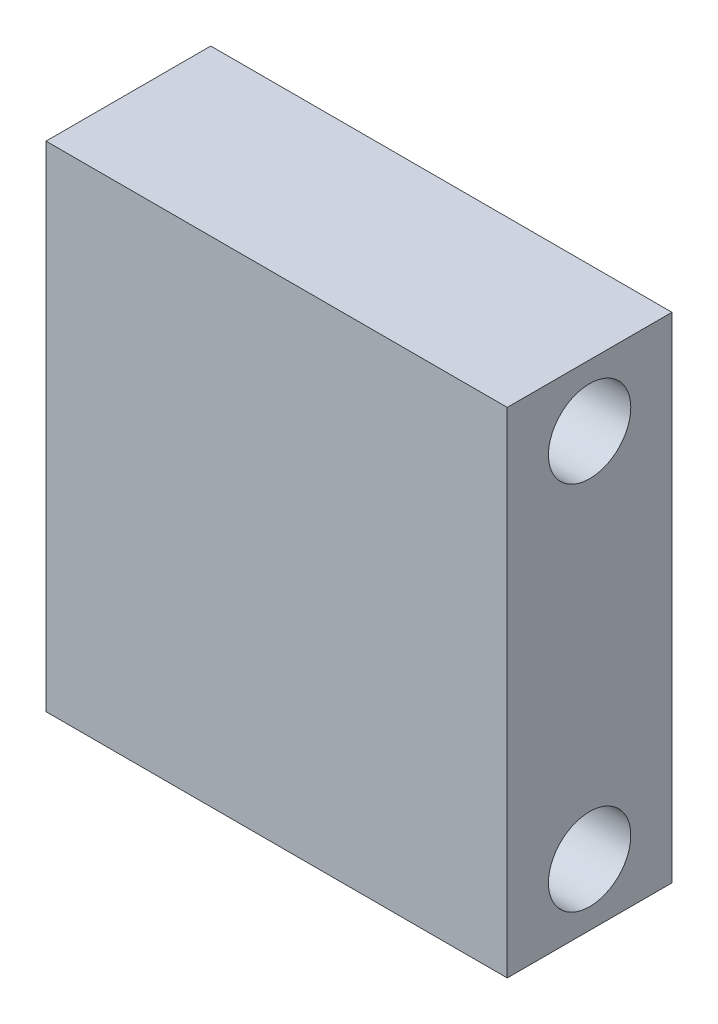
ISO-10303-21;
HEADER;
FILE_DESCRIPTION(('STEP AP214'),'2;1');
FILE_NAME('part.step','',(''),(''),'','','');
FILE_SCHEMA(('AUTOMOTIVE_DESIGN { 1 0 10303 214 1 1 1 1 }'));
ENDSEC;
DATA;
#1=APPLICATION_CONTEXT('core data for automotive mechanical design processes');
#2=APPLICATION_PROTOCOL_DEFINITION('international standard','automotive_design',2000,#1);
#3=PRODUCT_CONTEXT('',#1,'mechanical');
#4=PRODUCT('Part','Part','',(#3));
#5=PRODUCT_RELATED_PRODUCT_CATEGORY('part','',(#4));
#6=PRODUCT_DEFINITION_FORMATION('','',#4);
#7=PRODUCT_DEFINITION_CONTEXT('part definition',#1,'design');
#8=PRODUCT_DEFINITION('design','',#6,#7);
#9=PRODUCT_DEFINITION_SHAPE('','',#8);
#10=(LENGTH_UNIT() NAMED_UNIT(*) SI_UNIT(.MILLI.,.METRE.));
#11=(NAMED_UNIT(*) PLANE_ANGLE_UNIT() SI_UNIT($,.RADIAN.));
#12=(NAMED_UNIT(*) SI_UNIT($,.STERADIAN.) SOLID_ANGLE_UNIT());
#13=UNCERTAINTY_MEASURE_WITH_UNIT(LENGTH_MEASURE(1.E-05),#10,'distance_accuracy_value','');
#14=(GEOMETRIC_REPRESENTATION_CONTEXT(3) GLOBAL_UNCERTAINTY_ASSIGNED_CONTEXT((#13)) GLOBAL_UNIT_ASSIGNED_CONTEXT((#10,
#11,#12)) REPRESENTATION_CONTEXT('',''));
#15=CARTESIAN_POINT('',(0.,0.,0.));
#16=DIRECTION('',(0.,0.,1.));
#17=DIRECTION('',(1.,0.,0.));
#18=AXIS2_PLACEMENT_3D('',#15,#16,#17);
#19=CARTESIAN_POINT('',(56.,0.,0.));
#20=DIRECTION('',(1.,0.,0.));
#21=DIRECTION('',(0.,0.,-1.));
#22=AXIS2_PLACEMENT_3D('',#19,#20,#21);
#23=PLANE('',#22);
#24=CARTESIAN_POINT('',(56.,-22.5,0.));
#25=DIRECTION('',(1.,0.,0.));
#26=DIRECTION('',(0.,0.,1.));
#27=AXIS2_PLACEMENT_3D('',#24,#25,#26);
#28=CIRCLE('',#27,5.);
#29=CARTESIAN_POINT('',(56.,-22.5,5.));
#30=VERTEX_POINT('',#29);
#31=EDGE_CURVE('E100',#30,#30,#28,.T.);
#32=ORIENTED_EDGE('',*,*,#31,.F.);
#33=EDGE_LOOP('',(#32));
#34=FACE_BOUND('',#33,.T.);
#35=DIRECTION('',(0.,1.,0.));
#36=VECTOR('',#35,1.);
#37=CARTESIAN_POINT('',(56.,30.,-9.99999999999999));
#38=LINE('',#37,#36);
#39=CARTESIAN_POINT('',(56.,-30.,-10.));
#40=VERTEX_POINT('',#39);
#41=CARTESIAN_POINT('',(56.,30.,-9.99999999999999));
#42=VERTEX_POINT('',#41);
#43=EDGE_CURVE('E85',#40,#42,#38,.T.);
#44=ORIENTED_EDGE('',*,*,#43,.T.);
#45=DIRECTION('',(0.,0.,1.));
#46=VECTOR('',#45,1.);
#47=CARTESIAN_POINT('',(56.,30.,10.));
#48=LINE('',#47,#46);
#49=CARTESIAN_POINT('',(56.,30.,10.));
#50=VERTEX_POINT('',#49);
#51=EDGE_CURVE('E80',#42,#50,#48,.T.);
#52=ORIENTED_EDGE('',*,*,#51,.T.);
#53=DIRECTION('',(0.,-1.,0.));
#54=VECTOR('',#53,1.);
#55=CARTESIAN_POINT('',(56.,30.,10.));
#56=LINE('',#55,#54);
#57=CARTESIAN_POINT('',(56.,-30.,10.));
#58=VERTEX_POINT('',#57);
#59=EDGE_CURVE('E83',#50,#58,#56,.T.);
#60=ORIENTED_EDGE('',*,*,#59,.T.);
#61=DIRECTION('',(0.,0.,-1.));
#62=VECTOR('',#61,1.);
#63=CARTESIAN_POINT('',(56.,-30.,10.));
#64=LINE('',#63,#62);
#65=EDGE_CURVE('E50',#58,#40,#64,.T.);
#66=ORIENTED_EDGE('',*,*,#65,.T.);
#67=EDGE_LOOP('',(#44,#52,#60,#66));
#68=FACE_BOUND('',#67,.T.);
#69=CARTESIAN_POINT('',(56.,22.5,0.));
#70=DIRECTION('',(1.,0.,0.));
#71=DIRECTION('',(0.,0.,-1.));
#72=AXIS2_PLACEMENT_3D('',#69,#70,#71);
#73=CIRCLE('',#72,5.);
#74=CARTESIAN_POINT('',(56.,22.5,-5.));
#75=VERTEX_POINT('',#74);
#76=EDGE_CURVE('E115',#75,#75,#73,.T.);
#77=ORIENTED_EDGE('',*,*,#76,.F.);
#78=EDGE_LOOP('',(#77));
#79=FACE_BOUND('',#78,.T.);
#80=ADVANCED_FACE('F33',(#34,#68,#79),#23,.T.);
#81=CARTESIAN_POINT('',(0.,0.,0.));
#82=DIRECTION('',(1.,0.,0.));
#83=DIRECTION('',(0.,0.,-1.));
#84=AXIS2_PLACEMENT_3D('',#81,#82,#83);
#85=PLANE('',#84);
#86=DIRECTION('',(0.,1.,0.));
#87=VECTOR('',#86,1.);
#88=CARTESIAN_POINT('',(0.,30.,-9.99999999999999));
#89=LINE('',#88,#87);
#90=CARTESIAN_POINT('',(0.,-30.,-10.));
#91=VERTEX_POINT('',#90);
#92=CARTESIAN_POINT('',(0.,30.,-9.99999999999999));
#93=VERTEX_POINT('',#92);
#94=EDGE_CURVE('E97',#91,#93,#89,.T.);
#95=ORIENTED_EDGE('',*,*,#94,.F.);
#96=DIRECTION('',(0.,0.,-1.));
#97=VECTOR('',#96,1.);
#98=CARTESIAN_POINT('',(0.,-30.,10.));
#99=LINE('',#98,#97);
#100=CARTESIAN_POINT('',(0.,-30.,10.));
#101=VERTEX_POINT('',#100);
#102=EDGE_CURVE('E73',#101,#91,#99,.T.);
#103=ORIENTED_EDGE('',*,*,#102,.F.);
#104=DIRECTION('',(0.,-1.,0.));
#105=VECTOR('',#104,1.);
#106=CARTESIAN_POINT('',(0.,30.,10.));
#107=LINE('',#106,#105);
#108=CARTESIAN_POINT('',(0.,30.,10.));
#109=VERTEX_POINT('',#108);
#110=EDGE_CURVE('E67',#109,#101,#107,.T.);
#111=ORIENTED_EDGE('',*,*,#110,.F.);
#112=DIRECTION('',(0.,0.,1.));
#113=VECTOR('',#112,1.);
#114=CARTESIAN_POINT('',(0.,30.,10.));
#115=LINE('',#114,#113);
#116=EDGE_CURVE('E89',#93,#109,#115,.T.);
#117=ORIENTED_EDGE('',*,*,#116,.F.);
#118=EDGE_LOOP('',(#95,#103,#111,#117));
#119=FACE_BOUND('',#118,.T.);
#120=CARTESIAN_POINT('',(0.,-22.5,0.));
#121=DIRECTION('',(1.,0.,0.));
#122=DIRECTION('',(0.,0.,1.));
#123=AXIS2_PLACEMENT_3D('',#120,#121,#122);
#124=CIRCLE('',#123,5.);
#125=CARTESIAN_POINT('',(0.,-22.5,5.));
#126=VERTEX_POINT('',#125);
#127=EDGE_CURVE('E112',#126,#126,#124,.T.);
#128=ORIENTED_EDGE('',*,*,#127,.T.);
#129=EDGE_LOOP('',(#128));
#130=FACE_BOUND('',#129,.T.);
#131=CARTESIAN_POINT('',(0.,22.5,0.));
#132=DIRECTION('',(1.,0.,0.));
#133=DIRECTION('',(0.,0.,-1.));
#134=AXIS2_PLACEMENT_3D('',#131,#132,#133);
#135=CIRCLE('',#134,5.);
#136=CARTESIAN_POINT('',(0.,22.5,-5.));
#137=VERTEX_POINT('',#136);
#138=EDGE_CURVE('E118',#137,#137,#135,.T.);
#139=ORIENTED_EDGE('',*,*,#138,.T.);
#140=EDGE_LOOP('',(#139));
#141=FACE_BOUND('',#140,.T.);
#142=ADVANCED_FACE('F108',(#119,#130,#141),#85,.F.);
#143=CARTESIAN_POINT('',(56.,30.,-9.99999999999999));
#144=DIRECTION('',(0.,0.,1.));
#145=DIRECTION('',(0.,-1.,0.));
#146=AXIS2_PLACEMENT_3D('',#143,#144,#145);
#147=PLANE('',#146);
#148=ORIENTED_EDGE('',*,*,#94,.T.);
#149=DIRECTION('',(-1.,0.,0.));
#150=VECTOR('',#149,1.);
#151=CARTESIAN_POINT('',(56.,30.,-9.99999999999999));
#152=LINE('',#151,#150);
#153=EDGE_CURVE('E11',#42,#93,#152,.T.);
#154=ORIENTED_EDGE('',*,*,#153,.F.);
#155=ORIENTED_EDGE('',*,*,#43,.F.);
#156=DIRECTION('',(-1.,0.,0.));
#157=VECTOR('',#156,1.);
#158=CARTESIAN_POINT('',(56.,-30.,-10.));
#159=LINE('',#158,#157);
#160=EDGE_CURVE('E93',#40,#91,#159,.T.);
#161=ORIENTED_EDGE('',*,*,#160,.T.);
#162=EDGE_LOOP('',(#148,#154,#155,#161));
#163=FACE_BOUND('',#162,.T.);
#164=ADVANCED_FACE('F35',(#163),#147,.F.);
#165=CARTESIAN_POINT('',(56.,30.,10.));
#166=DIRECTION('',(0.,-1.,0.));
#167=DIRECTION('',(0.,0.,-1.));
#168=AXIS2_PLACEMENT_3D('',#165,#166,#167);
#169=PLANE('',#168);
#170=ORIENTED_EDGE('',*,*,#116,.T.);
#171=DIRECTION('',(-1.,0.,0.));
#172=VECTOR('',#171,1.);
#173=CARTESIAN_POINT('',(56.,30.,10.));
#174=LINE('',#173,#172);
#175=EDGE_CURVE('E42',#50,#109,#174,.T.);
#176=ORIENTED_EDGE('',*,*,#175,.F.);
#177=ORIENTED_EDGE('',*,*,#51,.F.);
#178=ORIENTED_EDGE('',*,*,#153,.T.);
#179=EDGE_LOOP('',(#170,#176,#177,#178));
#180=FACE_BOUND('',#179,.T.);
#181=ADVANCED_FACE('F88',(#180),#169,.F.);
#182=CARTESIAN_POINT('',(56.,30.,10.));
#183=DIRECTION('',(0.,0.,-1.));
#184=DIRECTION('',(0.,1.,0.));
#185=AXIS2_PLACEMENT_3D('',#182,#183,#184);
#186=PLANE('',#185);
#187=ORIENTED_EDGE('',*,*,#110,.T.);
#188=DIRECTION('',(-1.,0.,0.));
#189=VECTOR('',#188,1.);
#190=CARTESIAN_POINT('',(56.,-30.,10.));
#191=LINE('',#190,#189);
#192=EDGE_CURVE('E90',#58,#101,#191,.T.);
#193=ORIENTED_EDGE('',*,*,#192,.F.);
#194=ORIENTED_EDGE('',*,*,#59,.F.);
#195=ORIENTED_EDGE('',*,*,#175,.T.);
#196=EDGE_LOOP('',(#187,#193,#194,#195));
#197=FACE_BOUND('',#196,.T.);
#198=ADVANCED_FACE('F91',(#197),#186,.F.);
#199=CARTESIAN_POINT('',(56.,-30.,10.));
#200=DIRECTION('',(0.,1.,0.));
#201=DIRECTION('',(0.,0.,1.));
#202=AXIS2_PLACEMENT_3D('',#199,#200,#201);
#203=PLANE('',#202);
#204=ORIENTED_EDGE('',*,*,#102,.T.);
#205=ORIENTED_EDGE('',*,*,#160,.F.);
#206=ORIENTED_EDGE('',*,*,#65,.F.);
#207=ORIENTED_EDGE('',*,*,#192,.T.);
#208=EDGE_LOOP('',(#204,#205,#206,#207));
#209=FACE_BOUND('',#208,.T.);
#210=ADVANCED_FACE('F105',(#209),#203,.F.);
#211=CARTESIAN_POINT('',(56.,-22.5,0.));
#212=DIRECTION('',(-1.,0.,0.));
#213=DIRECTION('',(0.,0.,1.));
#214=AXIS2_PLACEMENT_3D('',#211,#212,#213);
#215=CYLINDRICAL_SURFACE('',#214,5.);
#216=ORIENTED_EDGE('',*,*,#31,.T.);
#217=EDGE_LOOP('',(#216));
#218=FACE_BOUND('',#217,.T.);
#219=ORIENTED_EDGE('',*,*,#127,.F.);
#220=EDGE_LOOP('',(#219));
#221=FACE_BOUND('',#220,.T.);
#222=ADVANCED_FACE('F135',(#218,#221),#215,.F.);
#223=CARTESIAN_POINT('',(56.,22.5,0.));
#224=DIRECTION('',(-1.,0.,0.));
#225=DIRECTION('',(0.,0.,1.));
#226=AXIS2_PLACEMENT_3D('',#223,#224,#225);
#227=CYLINDRICAL_SURFACE('',#226,5.);
#228=ORIENTED_EDGE('',*,*,#76,.T.);
#229=EDGE_LOOP('',(#228));
#230=FACE_BOUND('',#229,.T.);
#231=ORIENTED_EDGE('',*,*,#138,.F.);
#232=EDGE_LOOP('',(#231));
#233=FACE_BOUND('',#232,.T.);
#234=ADVANCED_FACE('F124',(#230,#233),#227,.F.);
#235=CLOSED_SHELL('',(#80,#142,#164,#181,#198,#210,#222,#234));
#236=MANIFOLD_SOLID_BREP('B2',#235);
#237=ADVANCED_BREP_SHAPE_REPRESENTATION('',(#18,#236),#14);
#238=SHAPE_DEFINITION_REPRESENTATION(#9,#237);
ENDSEC;
END-ISO-10303-21;
